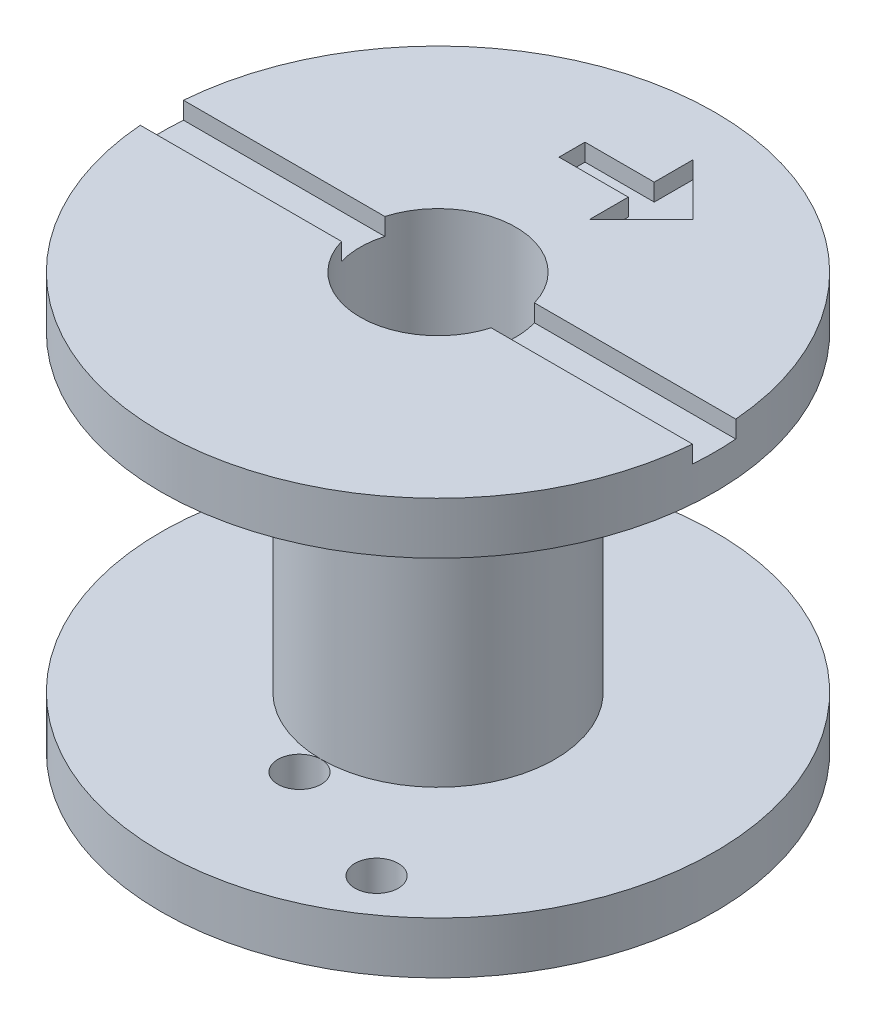
ISO-10303-21;
HEADER;
FILE_DESCRIPTION(('STEP AP214'),'2;1');
FILE_NAME('part.step','',(''),(''),'','','');
FILE_SCHEMA(('AUTOMOTIVE_DESIGN { 1 0 10303 214 1 1 1 1 }'));
ENDSEC;
DATA;
#1=APPLICATION_CONTEXT('core data for automotive mechanical design processes');
#2=APPLICATION_PROTOCOL_DEFINITION('international standard','automotive_design',2000,#1);
#3=PRODUCT_CONTEXT('',#1,'mechanical');
#4=PRODUCT('Part','Part','',(#3));
#5=PRODUCT_RELATED_PRODUCT_CATEGORY('part','',(#4));
#6=PRODUCT_DEFINITION_FORMATION('','',#4);
#7=PRODUCT_DEFINITION_CONTEXT('part definition',#1,'design');
#8=PRODUCT_DEFINITION('design','',#6,#7);
#9=PRODUCT_DEFINITION_SHAPE('','',#8);
#10=(LENGTH_UNIT() NAMED_UNIT(*) SI_UNIT(.MILLI.,.METRE.));
#11=(NAMED_UNIT(*) PLANE_ANGLE_UNIT() SI_UNIT($,.RADIAN.));
#12=(NAMED_UNIT(*) SI_UNIT($,.STERADIAN.) SOLID_ANGLE_UNIT());
#13=UNCERTAINTY_MEASURE_WITH_UNIT(LENGTH_MEASURE(1.E-05),#10,'distance_accuracy_value','');
#14=(GEOMETRIC_REPRESENTATION_CONTEXT(3) GLOBAL_UNCERTAINTY_ASSIGNED_CONTEXT((#13)) GLOBAL_UNIT_ASSIGNED_CONTEXT((#10,
#11,#12)) REPRESENTATION_CONTEXT('',''));
#15=CARTESIAN_POINT('',(0.,0.,0.));
#16=DIRECTION('',(0.,0.,1.));
#17=DIRECTION('',(1.,0.,0.));
#18=AXIS2_PLACEMENT_3D('',#15,#16,#17);
#19=CARTESIAN_POINT('',(0.,12.,16.));
#20=DIRECTION('',(0.,1.,0.));
#21=DIRECTION('',(0.,0.,1.));
#22=AXIS2_PLACEMENT_3D('',#19,#20,#21);
#23=PLANE('',#22);
#24=DIRECTION('',(1.,0.,0.));
#25=VECTOR('',#24,1.);
#26=CARTESIAN_POINT('',(0.,12.,1.25));
#27=LINE('',#26,#25);
#28=CARTESIAN_POINT('',(-15.9510971409493,12.,1.25));
#29=VERTEX_POINT('',#28);
#30=CARTESIAN_POINT('',(-4.32290411644765,12.,1.25));
#31=VERTEX_POINT('',#30);
#32=EDGE_CURVE('E166',#29,#31,#27,.T.);
#33=ORIENTED_EDGE('',*,*,#32,.F.);
#34=CARTESIAN_POINT('',(0.,12.,0.));
#35=DIRECTION('',(0.,1.,0.));
#36=DIRECTION('',(0.,0.,1.));
#37=AXIS2_PLACEMENT_3D('',#34,#35,#36);
#38=CIRCLE('',#37,16.);
#39=CARTESIAN_POINT('',(15.9510971409493,12.,1.25));
#40=VERTEX_POINT('',#39);
#41=EDGE_CURVE('E245',#29,#40,#38,.T.);
#42=ORIENTED_EDGE('',*,*,#41,.T.);
#43=CARTESIAN_POINT('',(4.32290411644765,12.,1.25));
#44=VERTEX_POINT('',#43);
#45=EDGE_CURVE('E171',#44,#40,#27,.T.);
#46=ORIENTED_EDGE('',*,*,#45,.F.);
#47=CARTESIAN_POINT('',(0.,12.,0.));
#48=DIRECTION('',(0.,1.,0.));
#49=DIRECTION('',(0.,0.,1.));
#50=AXIS2_PLACEMENT_3D('',#47,#48,#49);
#51=CIRCLE('',#50,4.5);
#52=EDGE_CURVE('E273',#31,#44,#51,.T.);
#53=ORIENTED_EDGE('',*,*,#52,.F.);
#54=EDGE_LOOP('',(#33,#42,#46,#53));
#55=FACE_BOUND('',#54,.T.);
#56=ADVANCED_FACE('F34',(#55),#23,.T.);
#57=DIRECTION('',(-1.,0.,0.));
#58=VECTOR('',#57,1.);
#59=CARTESIAN_POINT('',(0.,12.,-1.25));
#60=LINE('',#59,#58);
#61=CARTESIAN_POINT('',(15.9510971409493,12.,-1.25));
#62=VERTEX_POINT('',#61);
#63=CARTESIAN_POINT('',(4.32290411644765,12.,-1.25));
#64=VERTEX_POINT('',#63);
#65=EDGE_CURVE('E174',#62,#64,#60,.T.);
#66=ORIENTED_EDGE('',*,*,#65,.F.);
#67=CARTESIAN_POINT('',(-15.9510971409493,12.,-1.25));
#68=VERTEX_POINT('',#67);
#69=EDGE_CURVE('E248',#62,#68,#38,.T.);
#70=ORIENTED_EDGE('',*,*,#69,.T.);
#71=CARTESIAN_POINT('',(-4.32290411644765,12.,-1.25));
#72=VERTEX_POINT('',#71);
#73=EDGE_CURVE('E167',#72,#68,#60,.T.);
#74=ORIENTED_EDGE('',*,*,#73,.F.);
#75=EDGE_CURVE('E165',#64,#72,#51,.T.);
#76=ORIENTED_EDGE('',*,*,#75,.F.);
#77=EDGE_LOOP('',(#66,#70,#74,#76));
#78=FACE_BOUND('',#77,.T.);
#79=DIRECTION('',(0.,0.,1.));
#80=VECTOR('',#79,1.);
#81=CARTESIAN_POINT('',(-2.25827734000175,12.,-9.25));
#82=LINE('',#81,#80);
#83=CARTESIAN_POINT('',(-2.25827734000175,12.,-10.75));
#84=VERTEX_POINT('',#83);
#85=CARTESIAN_POINT('',(-2.25827734000175,12.,-9.25));
#86=VERTEX_POINT('',#85);
#87=EDGE_CURVE('E180',#84,#86,#82,.T.);
#88=ORIENTED_EDGE('',*,*,#87,.F.);
#89=DIRECTION('',(-1.,0.,0.));
#90=VECTOR('',#89,1.);
#91=CARTESIAN_POINT('',(-2.25827734000175,12.,-10.75));
#92=LINE('',#91,#90);
#93=CARTESIAN_POINT('',(1.74172265999826,12.,-10.75));
#94=VERTEX_POINT('',#93);
#95=EDGE_CURVE('E185',#94,#84,#92,.T.);
#96=ORIENTED_EDGE('',*,*,#95,.F.);
#97=DIRECTION('',(0.,0.,1.));
#98=VECTOR('',#97,1.);
#99=CARTESIAN_POINT('',(1.74172265999826,12.,-10.75));
#100=LINE('',#99,#98);
#101=CARTESIAN_POINT('',(1.74172265999825,12.,-13.0000002328018));
#102=VERTEX_POINT('',#101);
#103=EDGE_CURVE('E217',#102,#94,#100,.T.);
#104=ORIENTED_EDGE('',*,*,#103,.F.);
#105=DIRECTION('',(-0.707106753750594,0.,-0.7071068086225));
#106=VECTOR('',#105,1.);
#107=CARTESIAN_POINT('',(1.74172265999825,12.,-13.0000002328018));
#108=LINE('',#107,#106);
#109=CARTESIAN_POINT('',(4.74172265999825,12.,-10.));
#110=VERTEX_POINT('',#109);
#111=EDGE_CURVE('E214',#110,#102,#108,.T.);
#112=ORIENTED_EDGE('',*,*,#111,.F.);
#113=DIRECTION('',(0.707106808622502,0.,-0.707106753750592));
#114=VECTOR('',#113,1.);
#115=CARTESIAN_POINT('',(4.74172265999825,12.,-10.));
#116=LINE('',#115,#114);
#117=CARTESIAN_POINT('',(1.74172265999825,12.,-7.00000023280179));
#118=VERTEX_POINT('',#117);
#119=EDGE_CURVE('E211',#118,#110,#116,.T.);
#120=ORIENTED_EDGE('',*,*,#119,.F.);
#121=DIRECTION('',(0.,0.,1.));
#122=VECTOR('',#121,1.);
#123=CARTESIAN_POINT('',(1.74172265999825,12.,-7.00000023280179));
#124=LINE('',#123,#122);
#125=CARTESIAN_POINT('',(1.74172265999826,12.,-9.25));
#126=VERTEX_POINT('',#125);
#127=EDGE_CURVE('E208',#126,#118,#124,.T.);
#128=ORIENTED_EDGE('',*,*,#127,.F.);
#129=DIRECTION('',(1.,0.,0.));
#130=VECTOR('',#129,1.);
#131=CARTESIAN_POINT('',(1.74172265999826,12.,-9.25));
#132=LINE('',#131,#130);
#133=EDGE_CURVE('E205',#86,#126,#132,.T.);
#134=ORIENTED_EDGE('',*,*,#133,.F.);
#135=EDGE_LOOP('',(#88,#96,#104,#112,#120,#128,#134));
#136=FACE_BOUND('',#135,.T.);
#137=ADVANCED_FACE('F36',(#78,#136),#23,.T.);
#138=CARTESIAN_POINT('',(0.,15.5,0.));
#139=DIRECTION('',(0.,1.,0.));
#140=DIRECTION('',(0.,0.,1.));
#141=AXIS2_PLACEMENT_3D('',#138,#139,#140);
#142=CYLINDRICAL_SURFACE('',#141,4.5);
#143=DIRECTION('',(0.,1.,0.));
#144=VECTOR('',#143,1.);
#145=CARTESIAN_POINT('',(4.32290411644765,15.5,1.25));
#146=LINE('',#145,#144);
#147=CARTESIAN_POINT('',(4.32290411644765,11.,1.25));
#148=VERTEX_POINT('',#147);
#149=EDGE_CURVE('E178',#148,#44,#146,.T.);
#150=ORIENTED_EDGE('',*,*,#149,.F.);
#151=CARTESIAN_POINT('',(0.,11.,0.));
#152=DIRECTION('',(0.,-1.,0.));
#153=DIRECTION('',(0.,0.,-1.));
#154=AXIS2_PLACEMENT_3D('',#151,#152,#153);
#155=CIRCLE('',#154,4.5);
#156=CARTESIAN_POINT('',(4.32290411644765,11.,-1.25));
#157=VERTEX_POINT('',#156);
#158=EDGE_CURVE('E149',#157,#148,#155,.T.);
#159=ORIENTED_EDGE('',*,*,#158,.F.);
#160=DIRECTION('',(0.,1.,0.));
#161=VECTOR('',#160,1.);
#162=CARTESIAN_POINT('',(4.32290411644765,15.5,-1.25));
#163=LINE('',#162,#161);
#164=EDGE_CURVE('E172',#64,#157,#163,.F.);
#165=ORIENTED_EDGE('',*,*,#164,.F.);
#166=ORIENTED_EDGE('',*,*,#75,.T.);
#167=DIRECTION('',(0.,1.,0.));
#168=VECTOR('',#167,1.);
#169=CARTESIAN_POINT('',(-4.32290411644765,15.5,-1.25));
#170=LINE('',#169,#168);
#171=CARTESIAN_POINT('',(-4.32290411644765,11.,-1.25));
#172=VERTEX_POINT('',#171);
#173=EDGE_CURVE('E153',#172,#72,#170,.T.);
#174=ORIENTED_EDGE('',*,*,#173,.F.);
#175=CARTESIAN_POINT('',(-4.32290411644765,11.,1.25));
#176=VERTEX_POINT('',#175);
#177=EDGE_CURVE('E142',#176,#172,#155,.T.);
#178=ORIENTED_EDGE('',*,*,#177,.F.);
#179=DIRECTION('',(0.,1.,0.));
#180=VECTOR('',#179,1.);
#181=CARTESIAN_POINT('',(-4.32290411644765,15.5,1.25));
#182=LINE('',#181,#180);
#183=EDGE_CURVE('E169',#31,#176,#182,.F.);
#184=ORIENTED_EDGE('',*,*,#183,.F.);
#185=ORIENTED_EDGE('',*,*,#52,.T.);
#186=EDGE_LOOP('',(#150,#159,#165,#166,#174,#178,#184,#185));
#187=FACE_BOUND('',#186,.T.);
#188=CARTESIAN_POINT('',(0.,-14.,0.));
#189=DIRECTION('',(0.,1.,0.));
#190=DIRECTION('',(0.,0.,1.));
#191=AXIS2_PLACEMENT_3D('',#188,#189,#190);
#192=CIRCLE('',#191,4.5);
#193=CARTESIAN_POINT('',(0.,-14.,4.5));
#194=VERTEX_POINT('',#193);
#195=EDGE_CURVE('E270',#194,#194,#192,.T.);
#196=ORIENTED_EDGE('',*,*,#195,.F.);
#197=EDGE_LOOP('',(#196));
#198=FACE_BOUND('',#197,.T.);
#199=ADVANCED_FACE('F161',(#187,#198),#142,.F.);
#200=CARTESIAN_POINT('',(0.,-14.,6.5));
#201=DIRECTION('',(0.,-1.,0.));
#202=DIRECTION('',(0.,0.,-1.));
#203=AXIS2_PLACEMENT_3D('',#200,#201,#202);
#204=PLANE('',#203);
#205=ORIENTED_EDGE('',*,*,#195,.T.);
#206=EDGE_LOOP('',(#205));
#207=FACE_BOUND('',#206,.T.);
#208=CARTESIAN_POINT('',(0.,-14.,0.));
#209=DIRECTION('',(0.,1.,0.));
#210=DIRECTION('',(0.,0.,1.));
#211=AXIS2_PLACEMENT_3D('',#208,#209,#210);
#212=CIRCLE('',#211,6.5);
#213=CARTESIAN_POINT('',(0.,-14.,6.5));
#214=VERTEX_POINT('',#213);
#215=EDGE_CURVE('E267',#214,#214,#212,.T.);
#216=ORIENTED_EDGE('',*,*,#215,.F.);
#217=EDGE_LOOP('',(#216));
#218=FACE_BOUND('',#217,.T.);
#219=ADVANCED_FACE('F365',(#207,#218),#204,.T.);
#220=CARTESIAN_POINT('',(0.,15.5,0.));
#221=DIRECTION('',(0.,1.,0.));
#222=DIRECTION('',(0.,0.,1.));
#223=AXIS2_PLACEMENT_3D('',#220,#221,#222);
#224=CYLINDRICAL_SURFACE('',#223,6.5);
#225=ORIENTED_EDGE('',*,*,#215,.T.);
#226=EDGE_LOOP('',(#225));
#227=FACE_BOUND('',#226,.T.);
#228=CARTESIAN_POINT('',(0.,-12.,0.));
#229=DIRECTION('',(0.,1.,0.));
#230=DIRECTION('',(0.,0.,1.));
#231=AXIS2_PLACEMENT_3D('',#228,#229,#230);
#232=CIRCLE('',#231,6.5);
#233=CARTESIAN_POINT('',(0.,-12.,6.5));
#234=VERTEX_POINT('',#233);
#235=EDGE_CURVE('E264',#234,#234,#232,.T.);
#236=ORIENTED_EDGE('',*,*,#235,.F.);
#237=EDGE_LOOP('',(#236));
#238=FACE_BOUND('',#237,.T.);
#239=ADVANCED_FACE('F372',(#227,#238),#224,.T.);
#240=CARTESIAN_POINT('',(0.,-12.,16.));
#241=DIRECTION('',(0.,-1.,0.));
#242=DIRECTION('',(0.,0.,-1.));
#243=AXIS2_PLACEMENT_3D('',#240,#241,#242);
#244=PLANE('',#243);
#245=CARTESIAN_POINT('',(0.,-12.,8.));
#246=DIRECTION('',(0.,-1.,0.));
#247=DIRECTION('',(0.,0.,-1.));
#248=AXIS2_PLACEMENT_3D('',#245,#246,#247);
#249=CIRCLE('',#248,1.25);
#250=CARTESIAN_POINT('',(0.,-12.,6.75));
#251=VERTEX_POINT('',#250);
#252=EDGE_CURVE('E237',#251,#251,#249,.T.);
#253=ORIENTED_EDGE('',*,*,#252,.F.);
#254=EDGE_LOOP('',(#253));
#255=FACE_BOUND('',#254,.T.);
#256=CARTESIAN_POINT('',(7.42542500182777,-12.,10.973858188542));
#257=DIRECTION('',(0.,-1.,0.));
#258=DIRECTION('',(0.,0.,-1.));
#259=AXIS2_PLACEMENT_3D('',#256,#257,#258);
#260=CIRCLE('',#259,1.25);
#261=CARTESIAN_POINT('',(7.42542500182777,-12.,9.72385818854203));
#262=VERTEX_POINT('',#261);
#263=EDGE_CURVE('E224',#262,#262,#260,.T.);
#264=ORIENTED_EDGE('',*,*,#263,.F.);
#265=EDGE_LOOP('',(#264));
#266=FACE_BOUND('',#265,.T.);
#267=ORIENTED_EDGE('',*,*,#235,.T.);
#268=EDGE_LOOP('',(#267));
#269=FACE_BOUND('',#268,.T.);
#270=CARTESIAN_POINT('',(0.,-12.,0.));
#271=DIRECTION('',(0.,1.,0.));
#272=DIRECTION('',(0.,0.,1.));
#273=AXIS2_PLACEMENT_3D('',#270,#271,#272);
#274=CIRCLE('',#273,16.);
#275=CARTESIAN_POINT('',(0.,-12.,16.));
#276=VERTEX_POINT('',#275);
#277=EDGE_CURVE('E261',#276,#276,#274,.T.);
#278=ORIENTED_EDGE('',*,*,#277,.F.);
#279=EDGE_LOOP('',(#278));
#280=FACE_BOUND('',#279,.T.);
#281=ADVANCED_FACE('F380',(#255,#266,#269,#280),#244,.T.);
#282=CARTESIAN_POINT('',(0.,15.5,0.));
#283=DIRECTION('',(0.,1.,0.));
#284=DIRECTION('',(0.,0.,1.));
#285=AXIS2_PLACEMENT_3D('',#282,#283,#284);
#286=CYLINDRICAL_SURFACE('',#285,16.);
#287=ORIENTED_EDGE('',*,*,#277,.T.);
#288=EDGE_LOOP('',(#287));
#289=FACE_BOUND('',#288,.T.);
#290=CARTESIAN_POINT('',(0.,-9.00000000000001,0.));
#291=DIRECTION('',(0.,1.,0.));
#292=DIRECTION('',(0.,0.,1.));
#293=AXIS2_PLACEMENT_3D('',#290,#291,#292);
#294=CIRCLE('',#293,16.);
#295=CARTESIAN_POINT('',(0.,-9.00000000000001,16.));
#296=VERTEX_POINT('',#295);
#297=EDGE_CURVE('E258',#296,#296,#294,.T.);
#298=ORIENTED_EDGE('',*,*,#297,.F.);
#299=EDGE_LOOP('',(#298));
#300=FACE_BOUND('',#299,.T.);
#301=ADVANCED_FACE('F389',(#289,#300),#286,.T.);
#302=CARTESIAN_POINT('',(0.,-9.,16.));
#303=DIRECTION('',(0.,1.,0.));
#304=DIRECTION('',(0.,0.,1.));
#305=AXIS2_PLACEMENT_3D('',#302,#303,#304);
#306=PLANE('',#305);
#307=CARTESIAN_POINT('',(7.42542500182777,-9.,10.973858188542));
#308=DIRECTION('',(0.,1.,0.));
#309=DIRECTION('',(0.,0.,1.));
#310=AXIS2_PLACEMENT_3D('',#307,#308,#309);
#311=CIRCLE('',#310,1.25);
#312=CARTESIAN_POINT('',(7.42542500182777,-9.,12.223858188542));
#313=VERTEX_POINT('',#312);
#314=EDGE_CURVE('E244',#313,#313,#311,.T.);
#315=ORIENTED_EDGE('',*,*,#314,.F.);
#316=EDGE_LOOP('',(#315));
#317=FACE_BOUND('',#316,.T.);
#318=ORIENTED_EDGE('',*,*,#297,.T.);
#319=EDGE_LOOP('',(#318));
#320=FACE_BOUND('',#319,.T.);
#321=CARTESIAN_POINT('',(0.,-9.,0.));
#322=DIRECTION('',(0.,1.,0.));
#323=DIRECTION('',(0.,0.,1.));
#324=AXIS2_PLACEMENT_3D('',#321,#322,#323);
#325=CIRCLE('',#324,6.75);
#326=CARTESIAN_POINT('',(0.,-9.,6.75));
#327=VERTEX_POINT('',#326);
#328=EDGE_CURVE('E255',#327,#327,#325,.T.);
#329=ORIENTED_EDGE('',*,*,#328,.F.);
#330=CARTESIAN_POINT('',(0.,-9.,8.));
#331=DIRECTION('',(0.,1.,0.));
#332=DIRECTION('',(0.,0.,1.));
#333=AXIS2_PLACEMENT_3D('',#330,#331,#332);
#334=CIRCLE('',#333,1.25);
#335=EDGE_CURVE('E240',#327,#327,#334,.T.);
#336=ORIENTED_EDGE('',*,*,#335,.F.);
#337=EDGE_LOOP('',(#329,#336));
#338=FACE_BOUND('',#337,.T.);
#339=ADVANCED_FACE('F398',(#317,#320,#338),#306,.T.);
#340=CARTESIAN_POINT('',(0.,15.5,0.));
#341=DIRECTION('',(0.,1.,0.));
#342=DIRECTION('',(0.,0.,1.));
#343=AXIS2_PLACEMENT_3D('',#340,#341,#342);
#344=CYLINDRICAL_SURFACE('',#343,6.75);
#345=ORIENTED_EDGE('',*,*,#328,.T.);
#346=EDGE_LOOP('',(#345));
#347=FACE_BOUND('',#346,.T.);
#348=CARTESIAN_POINT('',(0.,9.,0.));
#349=DIRECTION('',(0.,1.,0.));
#350=DIRECTION('',(0.,0.,1.));
#351=AXIS2_PLACEMENT_3D('',#348,#349,#350);
#352=CIRCLE('',#351,6.75);
#353=CARTESIAN_POINT('',(0.,9.,6.75));
#354=VERTEX_POINT('',#353);
#355=EDGE_CURVE('E252',#354,#354,#352,.T.);
#356=ORIENTED_EDGE('',*,*,#355,.F.);
#357=EDGE_LOOP('',(#356));
#358=FACE_BOUND('',#357,.T.);
#359=ADVANCED_FACE('F405',(#347,#358),#344,.T.);
#360=CARTESIAN_POINT('',(0.,9.,16.));
#361=DIRECTION('',(0.,-1.,0.));
#362=DIRECTION('',(0.,0.,-1.));
#363=AXIS2_PLACEMENT_3D('',#360,#361,#362);
#364=PLANE('',#363);
#365=ORIENTED_EDGE('',*,*,#355,.T.);
#366=EDGE_LOOP('',(#365));
#367=FACE_BOUND('',#366,.T.);
#368=CARTESIAN_POINT('',(0.,9.,0.));
#369=DIRECTION('',(0.,1.,0.));
#370=DIRECTION('',(0.,0.,1.));
#371=AXIS2_PLACEMENT_3D('',#368,#369,#370);
#372=CIRCLE('',#371,16.);
#373=CARTESIAN_POINT('',(0.,9.,16.));
#374=VERTEX_POINT('',#373);
#375=EDGE_CURVE('E249',#374,#374,#372,.T.);
#376=ORIENTED_EDGE('',*,*,#375,.F.);
#377=EDGE_LOOP('',(#376));
#378=FACE_BOUND('',#377,.T.);
#379=ADVANCED_FACE('F413',(#367,#378),#364,.T.);
#380=CARTESIAN_POINT('',(0.,15.5,0.));
#381=DIRECTION('',(0.,1.,0.));
#382=DIRECTION('',(0.,0.,1.));
#383=AXIS2_PLACEMENT_3D('',#380,#381,#382);
#384=CYLINDRICAL_SURFACE('',#383,16.);
#385=DIRECTION('',(0.,1.,0.));
#386=VECTOR('',#385,1.);
#387=CARTESIAN_POINT('',(-15.9510971409493,15.5,1.25));
#388=LINE('',#387,#386);
#389=CARTESIAN_POINT('',(-15.9510971409493,11.,1.25));
#390=VERTEX_POINT('',#389);
#391=EDGE_CURVE('E11',#390,#29,#388,.T.);
#392=ORIENTED_EDGE('',*,*,#391,.F.);
#393=CARTESIAN_POINT('',(0.,11.,0.));
#394=DIRECTION('',(0.,-1.,0.));
#395=DIRECTION('',(0.,0.,-1.));
#396=AXIS2_PLACEMENT_3D('',#393,#394,#395);
#397=CIRCLE('',#396,16.);
#398=CARTESIAN_POINT('',(-15.9510971409493,11.,-1.25));
#399=VERTEX_POINT('',#398);
#400=EDGE_CURVE('E281',#399,#390,#397,.F.);
#401=ORIENTED_EDGE('',*,*,#400,.F.);
#402=DIRECTION('',(0.,1.,0.));
#403=VECTOR('',#402,1.);
#404=CARTESIAN_POINT('',(-15.9510971409493,15.5,-1.25));
#405=LINE('',#404,#403);
#406=EDGE_CURVE('E42',#68,#399,#405,.F.);
#407=ORIENTED_EDGE('',*,*,#406,.F.);
#408=ORIENTED_EDGE('',*,*,#69,.F.);
#409=DIRECTION('',(0.,1.,0.));
#410=VECTOR('',#409,1.);
#411=CARTESIAN_POINT('',(15.9510971409493,15.5,-1.25));
#412=LINE('',#411,#410);
#413=CARTESIAN_POINT('',(15.9510971409493,11.,-1.25));
#414=VERTEX_POINT('',#413);
#415=EDGE_CURVE('E280',#414,#62,#412,.T.);
#416=ORIENTED_EDGE('',*,*,#415,.F.);
#417=CARTESIAN_POINT('',(15.9510971409493,11.,1.25));
#418=VERTEX_POINT('',#417);
#419=EDGE_CURVE('E278',#418,#414,#397,.F.);
#420=ORIENTED_EDGE('',*,*,#419,.F.);
#421=DIRECTION('',(0.,1.,0.));
#422=VECTOR('',#421,1.);
#423=CARTESIAN_POINT('',(15.9510971409493,15.5,1.25));
#424=LINE('',#423,#422);
#425=EDGE_CURVE('E283',#40,#418,#424,.F.);
#426=ORIENTED_EDGE('',*,*,#425,.F.);
#427=ORIENTED_EDGE('',*,*,#41,.F.);
#428=EDGE_LOOP('',(#392,#401,#407,#408,#416,#420,#426,#427));
#429=FACE_BOUND('',#428,.T.);
#430=ORIENTED_EDGE('',*,*,#375,.T.);
#431=EDGE_LOOP('',(#430));
#432=FACE_BOUND('',#431,.T.);
#433=ADVANCED_FACE('F291',(#429,#432),#384,.T.);
#434=CARTESIAN_POINT('',(7.42542500182777,-2.99999999999999,10.973858188542));
#435=DIRECTION('',(0.,-1.,0.));
#436=DIRECTION('',(0.,0.,-1.));
#437=AXIS2_PLACEMENT_3D('',#434,#435,#436);
#438=CYLINDRICAL_SURFACE('',#437,1.25);
#439=ORIENTED_EDGE('',*,*,#314,.T.);
#440=EDGE_LOOP('',(#439));
#441=FACE_BOUND('',#440,.T.);
#442=ORIENTED_EDGE('',*,*,#263,.T.);
#443=EDGE_LOOP('',(#442));
#444=FACE_BOUND('',#443,.T.);
#445=ADVANCED_FACE('F427',(#441,#444),#438,.F.);
#446=CARTESIAN_POINT('',(0.,-2.99999999999999,8.));
#447=DIRECTION('',(0.,-1.,0.));
#448=DIRECTION('',(0.,0.,-1.));
#449=AXIS2_PLACEMENT_3D('',#446,#447,#448);
#450=CYLINDRICAL_SURFACE('',#449,1.25);
#451=ORIENTED_EDGE('',*,*,#335,.T.);
#452=EDGE_LOOP('',(#451));
#453=FACE_BOUND('',#452,.T.);
#454=ORIENTED_EDGE('',*,*,#252,.T.);
#455=EDGE_LOOP('',(#454));
#456=FACE_BOUND('',#455,.T.);
#457=ADVANCED_FACE('F434',(#453,#456),#450,.F.);
#458=CARTESIAN_POINT('',(-2.25827734000175,11.,-9.25));
#459=DIRECTION('',(-1.,0.,0.));
#460=DIRECTION('',(0.,0.,1.));
#461=AXIS2_PLACEMENT_3D('',#458,#459,#460);
#462=PLANE('',#461);
#463=ORIENTED_EDGE('',*,*,#87,.T.);
#464=DIRECTION('',(0.,1.,0.));
#465=VECTOR('',#464,1.);
#466=CARTESIAN_POINT('',(-2.25827734000175,11.,-9.25));
#467=LINE('',#466,#465);
#468=CARTESIAN_POINT('',(-2.25827734000175,11.,-9.25));
#469=VERTEX_POINT('',#468);
#470=EDGE_CURVE('E203',#469,#86,#467,.T.);
#471=ORIENTED_EDGE('',*,*,#470,.F.);
#472=DIRECTION('',(0.,0.,1.));
#473=VECTOR('',#472,1.);
#474=CARTESIAN_POINT('',(-2.25827734000175,11.,-9.25));
#475=LINE('',#474,#473);
#476=CARTESIAN_POINT('',(-2.25827734000175,11.,-10.75));
#477=VERTEX_POINT('',#476);
#478=EDGE_CURVE('E181',#477,#469,#475,.T.);
#479=ORIENTED_EDGE('',*,*,#478,.F.);
#480=DIRECTION('',(0.,1.,0.));
#481=VECTOR('',#480,1.);
#482=CARTESIAN_POINT('',(-2.25827734000175,11.,-10.75));
#483=LINE('',#482,#481);
#484=EDGE_CURVE('E222',#477,#84,#483,.T.);
#485=ORIENTED_EDGE('',*,*,#484,.T.);
#486=EDGE_LOOP('',(#463,#471,#479,#485));
#487=FACE_BOUND('',#486,.T.);
#488=ADVANCED_FACE('F319',(#487),#462,.F.);
#489=CARTESIAN_POINT('',(-2.25827734000175,11.,-10.75));
#490=DIRECTION('',(0.,0.,-1.));
#491=DIRECTION('',(-1.,0.,0.));
#492=AXIS2_PLACEMENT_3D('',#489,#490,#491);
#493=PLANE('',#492);
#494=ORIENTED_EDGE('',*,*,#95,.T.);
#495=ORIENTED_EDGE('',*,*,#484,.F.);
#496=DIRECTION('',(-1.,0.,0.));
#497=VECTOR('',#496,1.);
#498=CARTESIAN_POINT('',(-2.25827734000175,11.,-10.75));
#499=LINE('',#498,#497);
#500=CARTESIAN_POINT('',(1.74172265999826,11.,-10.75));
#501=VERTEX_POINT('',#500);
#502=EDGE_CURVE('E200',#501,#477,#499,.T.);
#503=ORIENTED_EDGE('',*,*,#502,.F.);
#504=DIRECTION('',(0.,1.,0.));
#505=VECTOR('',#504,1.);
#506=CARTESIAN_POINT('',(1.74172265999826,11.,-10.75));
#507=LINE('',#506,#505);
#508=EDGE_CURVE('E225',#501,#94,#507,.T.);
#509=ORIENTED_EDGE('',*,*,#508,.T.);
#510=EDGE_LOOP('',(#494,#495,#503,#509));
#511=FACE_BOUND('',#510,.T.);
#512=ADVANCED_FACE('F330',(#511),#493,.F.);
#513=CARTESIAN_POINT('',(1.74172265999826,11.,-10.75));
#514=DIRECTION('',(-1.,0.,0.));
#515=DIRECTION('',(0.,0.,1.));
#516=AXIS2_PLACEMENT_3D('',#513,#514,#515);
#517=PLANE('',#516);
#518=ORIENTED_EDGE('',*,*,#103,.T.);
#519=ORIENTED_EDGE('',*,*,#508,.F.);
#520=DIRECTION('',(0.,0.,1.));
#521=VECTOR('',#520,1.);
#522=CARTESIAN_POINT('',(1.74172265999826,11.,-10.75));
#523=LINE('',#522,#521);
#524=CARTESIAN_POINT('',(1.74172265999825,11.,-13.0000002328018));
#525=VERTEX_POINT('',#524);
#526=EDGE_CURVE('E197',#525,#501,#523,.T.);
#527=ORIENTED_EDGE('',*,*,#526,.F.);
#528=DIRECTION('',(0.,1.,0.));
#529=VECTOR('',#528,1.);
#530=CARTESIAN_POINT('',(1.74172265999825,11.,-13.0000002328018));
#531=LINE('',#530,#529);
#532=EDGE_CURVE('E227',#525,#102,#531,.T.);
#533=ORIENTED_EDGE('',*,*,#532,.T.);
#534=EDGE_LOOP('',(#518,#519,#527,#533));
#535=FACE_BOUND('',#534,.T.);
#536=ADVANCED_FACE('F332',(#535),#517,.F.);
#537=CARTESIAN_POINT('',(1.74172265999825,11.,-13.0000002328018));
#538=DIRECTION('',(0.7071068086225,0.,-0.707106753750594));
#539=DIRECTION('',(-0.707106753750594,0.,-0.7071068086225));
#540=AXIS2_PLACEMENT_3D('',#537,#538,#539);
#541=PLANE('',#540);
#542=ORIENTED_EDGE('',*,*,#111,.T.);
#543=ORIENTED_EDGE('',*,*,#532,.F.);
#544=DIRECTION('',(-0.707106753750594,0.,-0.7071068086225));
#545=VECTOR('',#544,1.);
#546=CARTESIAN_POINT('',(1.74172265999825,11.,-13.0000002328018));
#547=LINE('',#546,#545);
#548=CARTESIAN_POINT('',(4.74172265999825,11.,-10.));
#549=VERTEX_POINT('',#548);
#550=EDGE_CURVE('E194',#549,#525,#547,.T.);
#551=ORIENTED_EDGE('',*,*,#550,.F.);
#552=DIRECTION('',(0.,1.,0.));
#553=VECTOR('',#552,1.);
#554=CARTESIAN_POINT('',(4.74172265999825,11.,-10.));
#555=LINE('',#554,#553);
#556=EDGE_CURVE('E229',#549,#110,#555,.T.);
#557=ORIENTED_EDGE('',*,*,#556,.T.);
#558=EDGE_LOOP('',(#542,#543,#551,#557));
#559=FACE_BOUND('',#558,.T.);
#560=ADVANCED_FACE('F336',(#559),#541,.F.);
#561=CARTESIAN_POINT('',(4.74172265999825,11.,-10.));
#562=DIRECTION('',(0.707106753750592,0.,0.707106808622502));
#563=DIRECTION('',(0.707106808622502,0.,-0.707106753750592));
#564=AXIS2_PLACEMENT_3D('',#561,#562,#563);
#565=PLANE('',#564);
#566=ORIENTED_EDGE('',*,*,#119,.T.);
#567=ORIENTED_EDGE('',*,*,#556,.F.);
#568=DIRECTION('',(0.707106808622502,0.,-0.707106753750592));
#569=VECTOR('',#568,1.);
#570=CARTESIAN_POINT('',(4.74172265999825,11.,-10.));
#571=LINE('',#570,#569);
#572=CARTESIAN_POINT('',(1.74172265999825,11.,-7.00000023280179));
#573=VERTEX_POINT('',#572);
#574=EDGE_CURVE('E191',#573,#549,#571,.T.);
#575=ORIENTED_EDGE('',*,*,#574,.F.);
#576=DIRECTION('',(0.,1.,0.));
#577=VECTOR('',#576,1.);
#578=CARTESIAN_POINT('',(1.74172265999825,11.,-7.00000023280179));
#579=LINE('',#578,#577);
#580=EDGE_CURVE('E231',#573,#118,#579,.T.);
#581=ORIENTED_EDGE('',*,*,#580,.T.);
#582=EDGE_LOOP('',(#566,#567,#575,#581));
#583=FACE_BOUND('',#582,.T.);
#584=ADVANCED_FACE('F340',(#583),#565,.F.);
#585=CARTESIAN_POINT('',(1.74172265999825,11.,-7.00000023280179));
#586=DIRECTION('',(-1.,0.,0.));
#587=DIRECTION('',(0.,0.,1.));
#588=AXIS2_PLACEMENT_3D('',#585,#586,#587);
#589=PLANE('',#588);
#590=ORIENTED_EDGE('',*,*,#127,.T.);
#591=ORIENTED_EDGE('',*,*,#580,.F.);
#592=DIRECTION('',(0.,0.,1.));
#593=VECTOR('',#592,1.);
#594=CARTESIAN_POINT('',(1.74172265999825,11.,-7.00000023280179));
#595=LINE('',#594,#593);
#596=CARTESIAN_POINT('',(1.74172265999826,11.,-9.25));
#597=VERTEX_POINT('',#596);
#598=EDGE_CURVE('E188',#597,#573,#595,.T.);
#599=ORIENTED_EDGE('',*,*,#598,.F.);
#600=DIRECTION('',(0.,1.,0.));
#601=VECTOR('',#600,1.);
#602=CARTESIAN_POINT('',(1.74172265999826,11.,-9.25));
#603=LINE('',#602,#601);
#604=EDGE_CURVE('E233',#597,#126,#603,.T.);
#605=ORIENTED_EDGE('',*,*,#604,.T.);
#606=EDGE_LOOP('',(#590,#591,#599,#605));
#607=FACE_BOUND('',#606,.T.);
#608=ADVANCED_FACE('F342',(#607),#589,.F.);
#609=CARTESIAN_POINT('',(1.74172265999826,11.,-9.25));
#610=DIRECTION('',(0.,0.,1.));
#611=DIRECTION('',(1.,0.,0.));
#612=AXIS2_PLACEMENT_3D('',#609,#610,#611);
#613=PLANE('',#612);
#614=ORIENTED_EDGE('',*,*,#133,.T.);
#615=ORIENTED_EDGE('',*,*,#604,.F.);
#616=DIRECTION('',(1.,0.,0.));
#617=VECTOR('',#616,1.);
#618=CARTESIAN_POINT('',(1.74172265999826,11.,-9.25));
#619=LINE('',#618,#617);
#620=EDGE_CURVE('E184',#469,#597,#619,.T.);
#621=ORIENTED_EDGE('',*,*,#620,.F.);
#622=ORIENTED_EDGE('',*,*,#470,.T.);
#623=EDGE_LOOP('',(#614,#615,#621,#622));
#624=FACE_BOUND('',#623,.T.);
#625=ADVANCED_FACE('F323',(#624),#613,.F.);
#626=CARTESIAN_POINT('',(0.,11.,0.));
#627=DIRECTION('',(0.,-1.,0.));
#628=DIRECTION('',(0.,0.,-1.));
#629=AXIS2_PLACEMENT_3D('',#626,#627,#628);
#630=PLANE('',#629);
#631=ORIENTED_EDGE('',*,*,#478,.T.);
#632=ORIENTED_EDGE('',*,*,#620,.T.);
#633=ORIENTED_EDGE('',*,*,#598,.T.);
#634=ORIENTED_EDGE('',*,*,#574,.T.);
#635=ORIENTED_EDGE('',*,*,#550,.T.);
#636=ORIENTED_EDGE('',*,*,#526,.T.);
#637=ORIENTED_EDGE('',*,*,#502,.T.);
#638=EDGE_LOOP('',(#631,#632,#633,#634,#635,#636,#637));
#639=FACE_BOUND('',#638,.T.);
#640=ADVANCED_FACE('F326',(#639),#630,.F.);
#641=CARTESIAN_POINT('',(0.,11.,0.));
#642=DIRECTION('',(0.,-1.,0.));
#643=DIRECTION('',(0.,0.,-1.));
#644=AXIS2_PLACEMENT_3D('',#641,#642,#643);
#645=PLANE('',#644);
#646=ORIENTED_EDGE('',*,*,#158,.T.);
#647=DIRECTION('',(-1.,0.,0.));
#648=VECTOR('',#647,1.);
#649=CARTESIAN_POINT('',(21.3058325983219,11.,1.25));
#650=LINE('',#649,#648);
#651=EDGE_CURVE('E57',#418,#148,#650,.T.);
#652=ORIENTED_EDGE('',*,*,#651,.F.);
#653=ORIENTED_EDGE('',*,*,#419,.T.);
#654=DIRECTION('',(1.,0.,0.));
#655=VECTOR('',#654,1.);
#656=CARTESIAN_POINT('',(21.3058325983219,11.,-1.25));
#657=LINE('',#656,#655);
#658=EDGE_CURVE('E157',#157,#414,#657,.T.);
#659=ORIENTED_EDGE('',*,*,#658,.F.);
#660=EDGE_LOOP('',(#646,#652,#653,#659));
#661=FACE_BOUND('',#660,.T.);
#662=ADVANCED_FACE('F304',(#661),#645,.F.);
#663=CARTESIAN_POINT('',(21.3058325983219,27.,-1.25));
#664=DIRECTION('',(0.,0.,-1.));
#665=DIRECTION('',(-1.,0.,0.));
#666=AXIS2_PLACEMENT_3D('',#663,#664,#665);
#667=PLANE('',#666);
#668=ORIENTED_EDGE('',*,*,#164,.T.);
#669=ORIENTED_EDGE('',*,*,#658,.T.);
#670=ORIENTED_EDGE('',*,*,#415,.T.);
#671=ORIENTED_EDGE('',*,*,#65,.T.);
#672=EDGE_LOOP('',(#668,#669,#670,#671));
#673=FACE_BOUND('',#672,.T.);
#674=ADVANCED_FACE('F307',(#673),#667,.F.);
#675=CARTESIAN_POINT('',(21.3058325983219,27.,1.25));
#676=DIRECTION('',(0.,0.,1.));
#677=DIRECTION('',(1.,0.,0.));
#678=AXIS2_PLACEMENT_3D('',#675,#676,#677);
#679=PLANE('',#678);
#680=ORIENTED_EDGE('',*,*,#149,.T.);
#681=ORIENTED_EDGE('',*,*,#45,.T.);
#682=ORIENTED_EDGE('',*,*,#425,.T.);
#683=ORIENTED_EDGE('',*,*,#651,.T.);
#684=EDGE_LOOP('',(#680,#681,#682,#683));
#685=FACE_BOUND('',#684,.T.);
#686=ADVANCED_FACE('F300',(#685),#679,.F.);
#687=ORIENTED_EDGE('',*,*,#173,.T.);
#688=ORIENTED_EDGE('',*,*,#73,.T.);
#689=ORIENTED_EDGE('',*,*,#406,.T.);
#690=EDGE_CURVE('E49',#399,#172,#657,.T.);
#691=ORIENTED_EDGE('',*,*,#690,.T.);
#692=EDGE_LOOP('',(#687,#688,#689,#691));
#693=FACE_BOUND('',#692,.T.);
#694=ADVANCED_FACE('F152',(#693),#667,.F.);
#695=ORIENTED_EDGE('',*,*,#183,.T.);
#696=EDGE_CURVE('E145',#176,#390,#650,.T.);
#697=ORIENTED_EDGE('',*,*,#696,.T.);
#698=ORIENTED_EDGE('',*,*,#391,.T.);
#699=ORIENTED_EDGE('',*,*,#32,.T.);
#700=EDGE_LOOP('',(#695,#697,#698,#699));
#701=FACE_BOUND('',#700,.T.);
#702=ADVANCED_FACE('F287',(#701),#679,.F.);
#703=ORIENTED_EDGE('',*,*,#177,.T.);
#704=ORIENTED_EDGE('',*,*,#690,.F.);
#705=ORIENTED_EDGE('',*,*,#400,.T.);
#706=ORIENTED_EDGE('',*,*,#696,.F.);
#707=EDGE_LOOP('',(#703,#704,#705,#706));
#708=FACE_BOUND('',#707,.T.);
#709=ADVANCED_FACE('F143',(#708),#645,.F.);
#710=CLOSED_SHELL('',(#56,#137,#199,#219,#239,#281,#301,#339,#359,#379,#433,#445,#457,#488,#512,
#536,#560,#584,#608,#625,#640,#662,#674,#686,#694,#702,#709));
#711=MANIFOLD_SOLID_BREP('B2',#710);
#712=ADVANCED_BREP_SHAPE_REPRESENTATION('',(#18,#711),#14);
#713=SHAPE_DEFINITION_REPRESENTATION(#9,#712);
ENDSEC;
END-ISO-10303-21;
